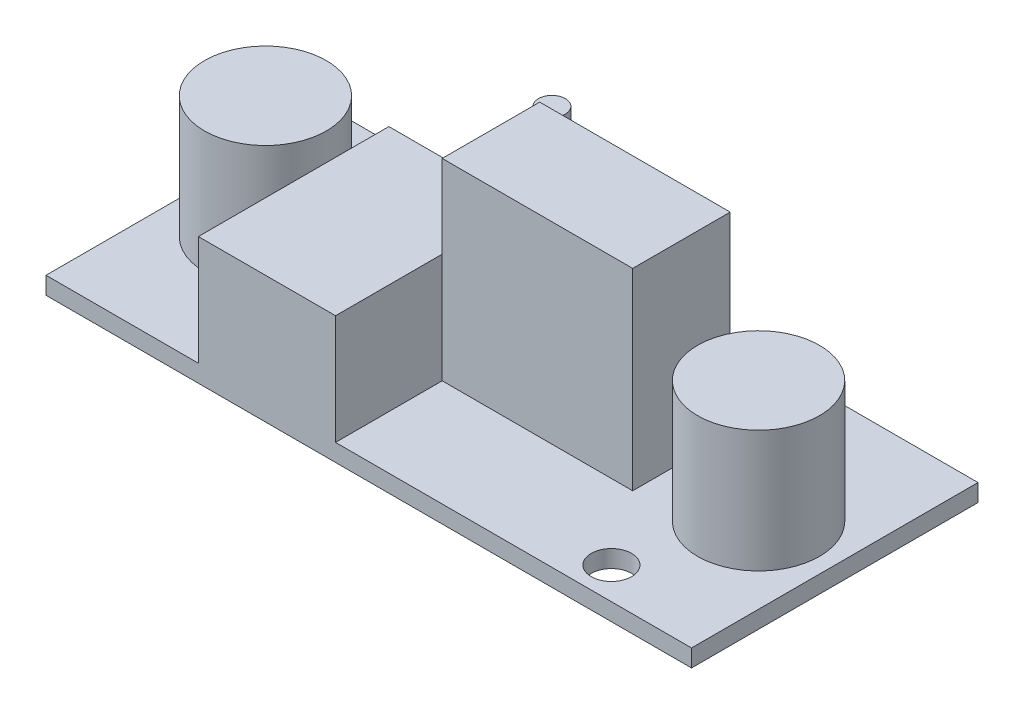
ISO-10303-21;
HEADER;
FILE_DESCRIPTION(('STEP AP214'),'2;1');
FILE_NAME('part.step','',(''),(''),'','','');
FILE_SCHEMA(('AUTOMOTIVE_DESIGN { 1 0 10303 214 1 1 1 1 }'));
ENDSEC;
DATA;
#1=APPLICATION_CONTEXT('core data for automotive mechanical design processes');
#2=APPLICATION_PROTOCOL_DEFINITION('international standard','automotive_design',2000,#1);
#3=PRODUCT_CONTEXT('',#1,'mechanical');
#4=PRODUCT('Part','Part','',(#3));
#5=PRODUCT_RELATED_PRODUCT_CATEGORY('part','',(#4));
#6=PRODUCT_DEFINITION_FORMATION('','',#4);
#7=PRODUCT_DEFINITION_CONTEXT('part definition',#1,'design');
#8=PRODUCT_DEFINITION('design','',#6,#7);
#9=PRODUCT_DEFINITION_SHAPE('','',#8);
#10=(LENGTH_UNIT() NAMED_UNIT(*) SI_UNIT(.MILLI.,.METRE.));
#11=(NAMED_UNIT(*) PLANE_ANGLE_UNIT() SI_UNIT($,.RADIAN.));
#12=(NAMED_UNIT(*) SI_UNIT($,.STERADIAN.) SOLID_ANGLE_UNIT());
#13=UNCERTAINTY_MEASURE_WITH_UNIT(LENGTH_MEASURE(1.E-05),#10,'distance_accuracy_value','');
#14=(GEOMETRIC_REPRESENTATION_CONTEXT(3) GLOBAL_UNCERTAINTY_ASSIGNED_CONTEXT((#13)) GLOBAL_UNIT_ASSIGNED_CONTEXT((#10,
#11,#12)) REPRESENTATION_CONTEXT('',''));
#15=CARTESIAN_POINT('',(0.,0.,0.));
#16=DIRECTION('',(0.,0.,1.));
#17=DIRECTION('',(1.,0.,0.));
#18=AXIS2_PLACEMENT_3D('',#15,#16,#17);
#19=CARTESIAN_POINT('',(-2.76860000000001,10.5918,11.938));
#20=DIRECTION('',(-1.,0.,0.));
#21=DIRECTION('',(0.,0.,1.));
#22=AXIS2_PLACEMENT_3D('',#19,#20,#21);
#23=PLANE('',#22);
#24=DIRECTION('',(0.,-1.,0.));
#25=VECTOR('',#24,1.);
#26=CARTESIAN_POINT('',(-2.76860000000001,17.5006,3.048));
#27=LINE('',#26,#25);
#28=CARTESIAN_POINT('',(-2.76860000000001,10.5918,3.048));
#29=VERTEX_POINT('',#28);
#30=CARTESIAN_POINT('',(-2.76860000000001,1.4478,3.048));
#31=VERTEX_POINT('',#30);
#32=EDGE_CURVE('E204',#29,#31,#27,.T.);
#33=ORIENTED_EDGE('',*,*,#32,.F.);
#34=DIRECTION('',(0.,0.,-1.));
#35=VECTOR('',#34,1.);
#36=CARTESIAN_POINT('',(-2.76860000000001,10.5918,11.938));
#37=LINE('',#36,#35);
#38=CARTESIAN_POINT('',(-2.76860000000001,10.5918,11.938));
#39=VERTEX_POINT('',#38);
#40=EDGE_CURVE('E240',#39,#29,#37,.T.);
#41=ORIENTED_EDGE('',*,*,#40,.F.);
#42=DIRECTION('',(0.,-1.,0.));
#43=VECTOR('',#42,1.);
#44=CARTESIAN_POINT('',(-2.76860000000001,10.5918,11.938));
#45=LINE('',#44,#43);
#46=CARTESIAN_POINT('',(-2.76860000000001,1.4478,11.938));
#47=VERTEX_POINT('',#46);
#48=EDGE_CURVE('E66',#39,#47,#45,.T.);
#49=ORIENTED_EDGE('',*,*,#48,.T.);
#50=DIRECTION('',(0.,0.,-1.));
#51=VECTOR('',#50,1.);
#52=CARTESIAN_POINT('',(-2.76860000000001,1.4478,11.938));
#53=LINE('',#52,#51);
#54=EDGE_CURVE('E251',#47,#31,#53,.T.);
#55=ORIENTED_EDGE('',*,*,#54,.T.);
#56=EDGE_LOOP('',(#33,#41,#49,#55));
#57=FACE_BOUND('',#56,.T.);
#58=ADVANCED_FACE('F43',(#57),#23,.F.);
#59=CARTESIAN_POINT('',(-26.8986,1.4478,-11.938));
#60=DIRECTION('',(0.,0.,-1.));
#61=DIRECTION('',(-1.,0.,0.));
#62=AXIS2_PLACEMENT_3D('',#59,#60,#61);
#63=PLANE('',#62);
#64=DIRECTION('',(1.,0.,0.));
#65=VECTOR('',#64,1.);
#66=CARTESIAN_POINT('',(-26.8986,0.,-11.938));
#67=LINE('',#66,#65);
#68=CARTESIAN_POINT('',(-26.8986,0.,-11.938));
#69=VERTEX_POINT('',#68);
#70=CARTESIAN_POINT('',(26.8986,0.,-11.938));
#71=VERTEX_POINT('',#70);
#72=EDGE_CURVE('E275',#69,#71,#67,.T.);
#73=ORIENTED_EDGE('',*,*,#72,.F.);
#74=DIRECTION('',(0.,-1.,0.));
#75=VECTOR('',#74,1.);
#76=CARTESIAN_POINT('',(-26.8986,1.4478,-11.938));
#77=LINE('',#76,#75);
#78=CARTESIAN_POINT('',(-26.8986,1.4478,-11.938));
#79=VERTEX_POINT('',#78);
#80=EDGE_CURVE('E309',#79,#69,#77,.T.);
#81=ORIENTED_EDGE('',*,*,#80,.F.);
#82=DIRECTION('',(1.,0.,0.));
#83=VECTOR('',#82,1.);
#84=CARTESIAN_POINT('',(-26.8986,1.4478,-11.938));
#85=LINE('',#84,#83);
#86=CARTESIAN_POINT('',(-8.61060000000001,1.4478,-11.938));
#87=VERTEX_POINT('',#86);
#88=EDGE_CURVE('E284',#79,#87,#85,.T.);
#89=ORIENTED_EDGE('',*,*,#88,.T.);
#90=DIRECTION('',(0.,-1.,0.));
#91=VECTOR('',#90,1.);
#92=CARTESIAN_POINT('',(-8.61060000000001,10.5918,-11.938));
#93=LINE('',#92,#91);
#94=CARTESIAN_POINT('',(-8.61060000000001,10.5918,-11.938));
#95=VERTEX_POINT('',#94);
#96=EDGE_CURVE('E58',#95,#87,#93,.T.);
#97=ORIENTED_EDGE('',*,*,#96,.F.);
#98=DIRECTION('',(1.,0.,0.));
#99=VECTOR('',#98,1.);
#100=CARTESIAN_POINT('',(-8.61060000000001,10.5918,-11.938));
#101=LINE('',#100,#99);
#102=CARTESIAN_POINT('',(0.86359999999999,10.5918,-11.938));
#103=VERTEX_POINT('',#102);
#104=EDGE_CURVE('E215',#95,#103,#101,.T.);
#105=ORIENTED_EDGE('',*,*,#104,.T.);
#106=DIRECTION('',(0.,-1.,0.));
#107=VECTOR('',#106,1.);
#108=CARTESIAN_POINT('',(0.86359999999999,10.5918,-11.938));
#109=LINE('',#108,#107);
#110=CARTESIAN_POINT('',(0.86359999999999,1.4478,-11.938));
#111=VERTEX_POINT('',#110);
#112=EDGE_CURVE('E230',#103,#111,#109,.T.);
#113=ORIENTED_EDGE('',*,*,#112,.T.);
#114=CARTESIAN_POINT('',(26.8986,1.4478,-11.938));
#115=VERTEX_POINT('',#114);
#116=EDGE_CURVE('E288',#111,#115,#85,.T.);
#117=ORIENTED_EDGE('',*,*,#116,.T.);
#118=DIRECTION('',(0.,-1.,0.));
#119=VECTOR('',#118,1.);
#120=CARTESIAN_POINT('',(26.8986,1.4478,-11.938));
#121=LINE('',#120,#119);
#122=EDGE_CURVE('E298',#115,#71,#121,.T.);
#123=ORIENTED_EDGE('',*,*,#122,.T.);
#124=EDGE_LOOP('',(#73,#81,#89,#97,#105,#113,#117,#123));
#125=FACE_BOUND('',#124,.T.);
#126=ADVANCED_FACE('F45',(#125),#63,.T.);
#127=CARTESIAN_POINT('',(-26.8986,1.4478,11.938));
#128=DIRECTION('',(-1.,0.,0.));
#129=DIRECTION('',(0.,0.,1.));
#130=AXIS2_PLACEMENT_3D('',#127,#128,#129);
#131=PLANE('',#130);
#132=DIRECTION('',(0.,0.,-1.));
#133=VECTOR('',#132,1.);
#134=CARTESIAN_POINT('',(-26.8986,0.,11.938));
#135=LINE('',#134,#133);
#136=CARTESIAN_POINT('',(-26.8986,0.,11.938));
#137=VERTEX_POINT('',#136);
#138=EDGE_CURVE('E306',#137,#69,#135,.T.);
#139=ORIENTED_EDGE('',*,*,#138,.F.);
#140=DIRECTION('',(0.,-1.,0.));
#141=VECTOR('',#140,1.);
#142=CARTESIAN_POINT('',(-26.8986,1.4478,11.938));
#143=LINE('',#142,#141);
#144=CARTESIAN_POINT('',(-26.8986,1.4478,11.938));
#145=VERTEX_POINT('',#144);
#146=EDGE_CURVE('E311',#145,#137,#143,.T.);
#147=ORIENTED_EDGE('',*,*,#146,.F.);
#148=DIRECTION('',(0.,0.,-1.));
#149=VECTOR('',#148,1.);
#150=CARTESIAN_POINT('',(-26.8986,1.4478,11.938));
#151=LINE('',#150,#149);
#152=EDGE_CURVE('E295',#145,#79,#151,.T.);
#153=ORIENTED_EDGE('',*,*,#152,.T.);
#154=ORIENTED_EDGE('',*,*,#80,.T.);
#155=EDGE_LOOP('',(#139,#147,#153,#154));
#156=FACE_BOUND('',#155,.T.);
#157=ADVANCED_FACE('F351',(#156),#131,.T.);
#158=CARTESIAN_POINT('',(-26.8986,1.4478,11.938));
#159=DIRECTION('',(0.,0.,-1.));
#160=DIRECTION('',(-1.,0.,0.));
#161=AXIS2_PLACEMENT_3D('',#158,#159,#160);
#162=PLANE('',#161);
#163=DIRECTION('',(1.,0.,0.));
#164=VECTOR('',#163,1.);
#165=CARTESIAN_POINT('',(-26.8986,0.,11.938));
#166=LINE('',#165,#164);
#167=CARTESIAN_POINT('',(26.8986,0.,11.938));
#168=VERTEX_POINT('',#167);
#169=EDGE_CURVE('E304',#137,#168,#166,.T.);
#170=ORIENTED_EDGE('',*,*,#169,.T.);
#171=DIRECTION('',(0.,-1.,0.));
#172=VECTOR('',#171,1.);
#173=CARTESIAN_POINT('',(26.8986,1.4478,11.938));
#174=LINE('',#173,#172);
#175=CARTESIAN_POINT('',(26.8986,1.4478,11.938));
#176=VERTEX_POINT('',#175);
#177=EDGE_CURVE('E313',#176,#168,#174,.T.);
#178=ORIENTED_EDGE('',*,*,#177,.F.);
#179=DIRECTION('',(1.,0.,0.));
#180=VECTOR('',#179,1.);
#181=CARTESIAN_POINT('',(-26.8986,1.4478,11.938));
#182=LINE('',#181,#180);
#183=EDGE_CURVE('E291',#47,#176,#182,.T.);
#184=ORIENTED_EDGE('',*,*,#183,.F.);
#185=ORIENTED_EDGE('',*,*,#48,.F.);
#186=DIRECTION('',(1.,0.,0.));
#187=VECTOR('',#186,1.);
#188=CARTESIAN_POINT('',(-14.1986,10.5918,11.938));
#189=LINE('',#188,#187);
#190=CARTESIAN_POINT('',(-14.1986,10.5918,11.938));
#191=VERTEX_POINT('',#190);
#192=EDGE_CURVE('E243',#191,#39,#189,.T.);
#193=ORIENTED_EDGE('',*,*,#192,.F.);
#194=DIRECTION('',(0.,-1.,0.));
#195=VECTOR('',#194,1.);
#196=CARTESIAN_POINT('',(-14.1986,10.5918,11.938));
#197=LINE('',#196,#195);
#198=CARTESIAN_POINT('',(-14.1986,1.4478,11.938));
#199=VERTEX_POINT('',#198);
#200=EDGE_CURVE('E258',#191,#199,#197,.T.);
#201=ORIENTED_EDGE('',*,*,#200,.T.);
#202=EDGE_CURVE('E292',#145,#199,#182,.T.);
#203=ORIENTED_EDGE('',*,*,#202,.F.);
#204=ORIENTED_EDGE('',*,*,#146,.T.);
#205=EDGE_LOOP('',(#170,#178,#184,#185,#193,#201,#203,#204));
#206=FACE_BOUND('',#205,.T.);
#207=ADVANCED_FACE('F537',(#206),#162,.F.);
#208=CARTESIAN_POINT('',(26.8986,1.4478,11.938));
#209=DIRECTION('',(-1.,0.,0.));
#210=DIRECTION('',(0.,0.,1.));
#211=AXIS2_PLACEMENT_3D('',#208,#209,#210);
#212=PLANE('',#211);
#213=DIRECTION('',(0.,0.,-1.));
#214=VECTOR('',#213,1.);
#215=CARTESIAN_POINT('',(26.8986,0.,11.938));
#216=LINE('',#215,#214);
#217=EDGE_CURVE('E301',#168,#71,#216,.T.);
#218=ORIENTED_EDGE('',*,*,#217,.T.);
#219=ORIENTED_EDGE('',*,*,#122,.F.);
#220=DIRECTION('',(0.,0.,-1.));
#221=VECTOR('',#220,1.);
#222=CARTESIAN_POINT('',(26.8986,1.4478,11.938));
#223=LINE('',#222,#221);
#224=EDGE_CURVE('E287',#176,#115,#223,.T.);
#225=ORIENTED_EDGE('',*,*,#224,.F.);
#226=ORIENTED_EDGE('',*,*,#177,.T.);
#227=EDGE_LOOP('',(#218,#219,#225,#226));
#228=FACE_BOUND('',#227,.T.);
#229=ADVANCED_FACE('F325',(#228),#212,.F.);
#230=CARTESIAN_POINT('',(0.,1.4478,0.));
#231=DIRECTION('',(0.,1.,0.));
#232=DIRECTION('',(0.,0.,1.));
#233=AXIS2_PLACEMENT_3D('',#230,#231,#232);
#234=PLANE('',#233);
#235=DIRECTION('',(0.,0.,-1.));
#236=VECTOR('',#235,1.);
#237=CARTESIAN_POINT('',(-2.76860000000001,1.4478,3.048));
#238=LINE('',#237,#236);
#239=CARTESIAN_POINT('',(-2.76860000000001,1.4478,-3.937));
#240=VERTEX_POINT('',#239);
#241=CARTESIAN_POINT('',(-2.76860000000001,1.4478,-5.08));
#242=VERTEX_POINT('',#241);
#243=EDGE_CURVE('E187',#240,#242,#238,.T.);
#244=ORIENTED_EDGE('',*,*,#243,.T.);
#245=DIRECTION('',(1.,0.,0.));
#246=VECTOR('',#245,1.);
#247=CARTESIAN_POINT('',(-2.76860000000001,1.4478,-5.08));
#248=LINE('',#247,#246);
#249=CARTESIAN_POINT('',(13.1064,1.4478,-5.08));
#250=VERTEX_POINT('',#249);
#251=EDGE_CURVE('E195',#242,#250,#248,.T.);
#252=ORIENTED_EDGE('',*,*,#251,.T.);
#253=DIRECTION('',(0.,0.,-1.));
#254=VECTOR('',#253,1.);
#255=CARTESIAN_POINT('',(13.1064,1.4478,3.048));
#256=LINE('',#255,#254);
#257=CARTESIAN_POINT('',(13.1064,1.4478,3.048));
#258=VERTEX_POINT('',#257);
#259=EDGE_CURVE('E178',#258,#250,#256,.T.);
#260=ORIENTED_EDGE('',*,*,#259,.F.);
#261=DIRECTION('',(1.,0.,0.));
#262=VECTOR('',#261,1.);
#263=CARTESIAN_POINT('',(-2.76860000000001,1.4478,3.048));
#264=LINE('',#263,#262);
#265=EDGE_CURVE('E190',#31,#258,#264,.T.);
#266=ORIENTED_EDGE('',*,*,#265,.F.);
#267=ORIENTED_EDGE('',*,*,#54,.F.);
#268=ORIENTED_EDGE('',*,*,#183,.T.);
#269=ORIENTED_EDGE('',*,*,#224,.T.);
#270=ORIENTED_EDGE('',*,*,#116,.F.);
#271=DIRECTION('',(0.,0.,1.));
#272=VECTOR('',#271,1.);
#273=CARTESIAN_POINT('',(0.86359999999999,1.4478,-11.938));
#274=LINE('',#273,#272);
#275=CARTESIAN_POINT('',(0.863599999999991,1.4478,-7.7216));
#276=VERTEX_POINT('',#275);
#277=EDGE_CURVE('E223',#111,#276,#274,.T.);
#278=ORIENTED_EDGE('',*,*,#277,.T.);
#279=DIRECTION('',(1.,0.,0.));
#280=VECTOR('',#279,1.);
#281=CARTESIAN_POINT('',(-8.61060000000001,1.4478,-7.7216));
#282=LINE('',#281,#280);
#283=CARTESIAN_POINT('',(-8.61060000000001,1.4478,-7.7216));
#284=VERTEX_POINT('',#283);
#285=EDGE_CURVE('E208',#284,#276,#282,.T.);
#286=ORIENTED_EDGE('',*,*,#285,.F.);
#287=DIRECTION('',(0.,0.,1.));
#288=VECTOR('',#287,1.);
#289=CARTESIAN_POINT('',(-8.61060000000001,1.4478,-11.938));
#290=LINE('',#289,#288);
#291=EDGE_CURVE('E212',#87,#284,#290,.T.);
#292=ORIENTED_EDGE('',*,*,#291,.F.);
#293=ORIENTED_EDGE('',*,*,#88,.F.);
#294=ORIENTED_EDGE('',*,*,#152,.F.);
#295=ORIENTED_EDGE('',*,*,#202,.T.);
#296=DIRECTION('',(0.,0.,-1.));
#297=VECTOR('',#296,1.);
#298=CARTESIAN_POINT('',(-14.1986,1.4478,11.938));
#299=LINE('',#298,#297);
#300=CARTESIAN_POINT('',(-14.1986,1.4478,-3.937));
#301=VERTEX_POINT('',#300);
#302=EDGE_CURVE('E239',#199,#301,#299,.T.);
#303=ORIENTED_EDGE('',*,*,#302,.T.);
#304=DIRECTION('',(1.,0.,0.));
#305=VECTOR('',#304,1.);
#306=CARTESIAN_POINT('',(-14.1986,1.4478,-3.937));
#307=LINE('',#306,#305);
#308=EDGE_CURVE('E234',#301,#240,#307,.T.);
#309=ORIENTED_EDGE('',*,*,#308,.T.);
#310=EDGE_LOOP('',(#244,#252,#260,#266,#267,#268,#269,#270,#278,#286,#292,#293,#294,#295,#303,#309));
#311=FACE_BOUND('',#310,.T.);
#312=CARTESIAN_POINT('',(-20.5486,1.4478,0.));
#313=DIRECTION('',(0.,1.,0.));
#314=DIRECTION('',(0.,0.,1.));
#315=AXIS2_PLACEMENT_3D('',#312,#313,#314);
#316=CIRCLE('',#315,5.08);
#317=CARTESIAN_POINT('',(-20.5486,1.4478,5.08));
#318=VERTEX_POINT('',#317);
#319=EDGE_CURVE('E263',#318,#318,#316,.T.);
#320=ORIENTED_EDGE('',*,*,#319,.F.);
#321=EDGE_LOOP('',(#320));
#322=FACE_BOUND('',#321,.T.);
#323=CARTESIAN_POINT('',(20.5486,1.4478,0.));
#324=DIRECTION('',(0.,1.,0.));
#325=DIRECTION('',(0.,0.,1.));
#326=AXIS2_PLACEMENT_3D('',#323,#324,#325);
#327=CIRCLE('',#326,5.08);
#328=CARTESIAN_POINT('',(20.5486,1.4478,5.07999999999996));
#329=VERTEX_POINT('',#328);
#330=EDGE_CURVE('E51',#329,#329,#327,.T.);
#331=ORIENTED_EDGE('',*,*,#330,.F.);
#332=EDGE_LOOP('',(#331));
#333=FACE_BOUND('',#332,.T.);
#334=CARTESIAN_POINT('',(-17.5768,1.4478,-9.29005));
#335=DIRECTION('',(0.,1.,0.));
#336=DIRECTION('',(0.,0.,1.));
#337=AXIS2_PLACEMENT_3D('',#334,#335,#336);
#338=CIRCLE('',#337,1.68275);
#339=CARTESIAN_POINT('',(-17.5768,1.4478,-7.6073));
#340=VERTEX_POINT('',#339);
#341=EDGE_CURVE('E276',#340,#340,#338,.T.);
#342=ORIENTED_EDGE('',*,*,#341,.F.);
#343=EDGE_LOOP('',(#342));
#344=FACE_BOUND('',#343,.T.);
#345=CARTESIAN_POINT('',(17.5768,1.4478,9.29005));
#346=DIRECTION('',(0.,1.,0.));
#347=DIRECTION('',(0.,0.,1.));
#348=AXIS2_PLACEMENT_3D('',#345,#346,#347);
#349=CIRCLE('',#348,1.68275);
#350=CARTESIAN_POINT('',(17.5768,1.4478,10.9728));
#351=VERTEX_POINT('',#350);
#352=EDGE_CURVE('E279',#351,#351,#349,.T.);
#353=ORIENTED_EDGE('',*,*,#352,.F.);
#354=EDGE_LOOP('',(#353));
#355=FACE_BOUND('',#354,.T.);
#356=ADVANCED_FACE('F321',(#311,#322,#333,#344,#355),#234,.T.);
#357=CARTESIAN_POINT('',(0.,0.,0.));
#358=DIRECTION('',(0.,1.,0.));
#359=DIRECTION('',(0.,0.,1.));
#360=AXIS2_PLACEMENT_3D('',#357,#358,#359);
#361=PLANE('',#360);
#362=CARTESIAN_POINT('',(-17.5768,0.,-9.29005));
#363=DIRECTION('',(0.,1.,0.));
#364=DIRECTION('',(0.,0.,1.));
#365=AXIS2_PLACEMENT_3D('',#362,#363,#364);
#366=CIRCLE('',#365,1.68275);
#367=CARTESIAN_POINT('',(-17.5768,0.,-7.6073));
#368=VERTEX_POINT('',#367);
#369=EDGE_CURVE('E272',#368,#368,#366,.T.);
#370=ORIENTED_EDGE('',*,*,#369,.T.);
#371=EDGE_LOOP('',(#370));
#372=FACE_BOUND('',#371,.T.);
#373=CARTESIAN_POINT('',(17.5768,0.,9.29005));
#374=DIRECTION('',(0.,1.,0.));
#375=DIRECTION('',(0.,0.,1.));
#376=AXIS2_PLACEMENT_3D('',#373,#374,#375);
#377=CIRCLE('',#376,1.68275);
#378=CARTESIAN_POINT('',(17.5768,0.,10.9728));
#379=VERTEX_POINT('',#378);
#380=EDGE_CURVE('E271',#379,#379,#377,.T.);
#381=ORIENTED_EDGE('',*,*,#380,.T.);
#382=EDGE_LOOP('',(#381));
#383=FACE_BOUND('',#382,.T.);
#384=ORIENTED_EDGE('',*,*,#72,.T.);
#385=ORIENTED_EDGE('',*,*,#217,.F.);
#386=ORIENTED_EDGE('',*,*,#169,.F.);
#387=ORIENTED_EDGE('',*,*,#138,.T.);
#388=EDGE_LOOP('',(#384,#385,#386,#387));
#389=FACE_BOUND('',#388,.T.);
#390=ADVANCED_FACE('F324',(#372,#383,#389),#361,.F.);
#391=CARTESIAN_POINT('',(17.5768,0.,9.29005));
#392=DIRECTION('',(0.,1.,0.));
#393=DIRECTION('',(0.,0.,1.));
#394=AXIS2_PLACEMENT_3D('',#391,#392,#393);
#395=CYLINDRICAL_SURFACE('',#394,1.68275);
#396=ORIENTED_EDGE('',*,*,#380,.F.);
#397=EDGE_LOOP('',(#396));
#398=FACE_BOUND('',#397,.T.);
#399=ORIENTED_EDGE('',*,*,#352,.T.);
#400=EDGE_LOOP('',(#399));
#401=FACE_BOUND('',#400,.T.);
#402=ADVANCED_FACE('F332',(#398,#401),#395,.F.);
#403=CARTESIAN_POINT('',(-17.5768,0.,-9.29005));
#404=DIRECTION('',(0.,1.,0.));
#405=DIRECTION('',(0.,0.,1.));
#406=AXIS2_PLACEMENT_3D('',#403,#404,#405);
#407=CYLINDRICAL_SURFACE('',#406,1.68275);
#408=ORIENTED_EDGE('',*,*,#369,.F.);
#409=EDGE_LOOP('',(#408));
#410=FACE_BOUND('',#409,.T.);
#411=ORIENTED_EDGE('',*,*,#341,.T.);
#412=EDGE_LOOP('',(#411));
#413=FACE_BOUND('',#412,.T.);
#414=ADVANCED_FACE('F334',(#410,#413),#407,.F.);
#415=CARTESIAN_POINT('',(20.5486,11.6078,0.));
#416=DIRECTION('',(0.,-1.,0.));
#417=DIRECTION('',(0.,0.,-1.));
#418=AXIS2_PLACEMENT_3D('',#415,#416,#417);
#419=CYLINDRICAL_SURFACE('',#418,5.08);
#420=CARTESIAN_POINT('',(20.5486,11.6078,0.));
#421=DIRECTION('',(0.,1.,0.));
#422=DIRECTION('',(0.,0.,1.));
#423=AXIS2_PLACEMENT_3D('',#420,#421,#422);
#424=CIRCLE('',#423,5.08);
#425=CARTESIAN_POINT('',(20.5486,11.6078,5.07999999999996));
#426=VERTEX_POINT('',#425);
#427=EDGE_CURVE('E266',#426,#426,#424,.F.);
#428=ORIENTED_EDGE('',*,*,#427,.T.);
#429=EDGE_LOOP('',(#428));
#430=FACE_BOUND('',#429,.T.);
#431=ORIENTED_EDGE('',*,*,#330,.T.);
#432=EDGE_LOOP('',(#431));
#433=FACE_BOUND('',#432,.T.);
#434=ADVANCED_FACE('F319',(#430,#433),#419,.T.);
#435=CARTESIAN_POINT('',(0.,11.6078,0.));
#436=DIRECTION('',(0.,1.,0.));
#437=DIRECTION('',(0.,0.,1.));
#438=AXIS2_PLACEMENT_3D('',#435,#436,#437);
#439=PLANE('',#438);
#440=ORIENTED_EDGE('',*,*,#427,.F.);
#441=EDGE_LOOP('',(#440));
#442=FACE_BOUND('',#441,.T.);
#443=ADVANCED_FACE('F366',(#442),#439,.T.);
#444=CARTESIAN_POINT('',(-20.5486,11.6078,0.));
#445=DIRECTION('',(0.,-1.,0.));
#446=DIRECTION('',(0.,0.,-1.));
#447=AXIS2_PLACEMENT_3D('',#444,#445,#446);
#448=CYLINDRICAL_SURFACE('',#447,5.08);
#449=CARTESIAN_POINT('',(-20.5486,11.6078,0.));
#450=DIRECTION('',(0.,1.,0.));
#451=DIRECTION('',(0.,0.,1.));
#452=AXIS2_PLACEMENT_3D('',#449,#450,#451);
#453=CIRCLE('',#452,5.08);
#454=CARTESIAN_POINT('',(-20.5486,11.6078,5.08));
#455=VERTEX_POINT('',#454);
#456=EDGE_CURVE('E257',#455,#455,#453,.T.);
#457=ORIENTED_EDGE('',*,*,#456,.F.);
#458=EDGE_LOOP('',(#457));
#459=FACE_BOUND('',#458,.T.);
#460=ORIENTED_EDGE('',*,*,#319,.T.);
#461=EDGE_LOOP('',(#460));
#462=FACE_BOUND('',#461,.T.);
#463=ADVANCED_FACE('F363',(#459,#462),#448,.T.);
#464=CARTESIAN_POINT('',(0.,11.6078,0.));
#465=DIRECTION('',(0.,1.,0.));
#466=DIRECTION('',(0.,0.,1.));
#467=AXIS2_PLACEMENT_3D('',#464,#465,#466);
#468=PLANE('',#467);
#469=ORIENTED_EDGE('',*,*,#456,.T.);
#470=EDGE_LOOP('',(#469));
#471=FACE_BOUND('',#470,.T.);
#472=ADVANCED_FACE('F361',(#471),#468,.T.);
#473=CARTESIAN_POINT('',(-14.1986,10.5918,-3.937));
#474=DIRECTION('',(0.,0.,-1.));
#475=DIRECTION('',(-1.,0.,0.));
#476=AXIS2_PLACEMENT_3D('',#473,#474,#475);
#477=PLANE('',#476);
#478=ORIENTED_EDGE('',*,*,#308,.F.);
#479=DIRECTION('',(0.,-1.,0.));
#480=VECTOR('',#479,1.);
#481=CARTESIAN_POINT('',(-14.1986,10.5918,-3.937));
#482=LINE('',#481,#480);
#483=CARTESIAN_POINT('',(-14.1986,10.5918,-3.937));
#484=VERTEX_POINT('',#483);
#485=EDGE_CURVE('E255',#484,#301,#482,.T.);
#486=ORIENTED_EDGE('',*,*,#485,.F.);
#487=DIRECTION('',(1.,0.,0.));
#488=VECTOR('',#487,1.);
#489=CARTESIAN_POINT('',(-14.1986,10.5918,-3.937));
#490=LINE('',#489,#488);
#491=CARTESIAN_POINT('',(-2.76860000000001,10.5918,-3.937));
#492=VERTEX_POINT('',#491);
#493=EDGE_CURVE('E235',#484,#492,#490,.T.);
#494=ORIENTED_EDGE('',*,*,#493,.T.);
#495=DIRECTION('',(0.,-1.,0.));
#496=VECTOR('',#495,1.);
#497=CARTESIAN_POINT('',(-2.76860000000001,10.5918,-3.937));
#498=LINE('',#497,#496);
#499=EDGE_CURVE('E248',#492,#240,#498,.T.);
#500=ORIENTED_EDGE('',*,*,#499,.T.);
#501=EDGE_LOOP('',(#478,#486,#494,#500));
#502=FACE_BOUND('',#501,.T.);
#503=ADVANCED_FACE('F358',(#502),#477,.T.);
#504=CARTESIAN_POINT('',(-14.1986,10.5918,11.938));
#505=DIRECTION('',(-1.,0.,0.));
#506=DIRECTION('',(0.,0.,1.));
#507=AXIS2_PLACEMENT_3D('',#504,#505,#506);
#508=PLANE('',#507);
#509=ORIENTED_EDGE('',*,*,#302,.F.);
#510=ORIENTED_EDGE('',*,*,#200,.F.);
#511=DIRECTION('',(0.,0.,-1.));
#512=VECTOR('',#511,1.);
#513=CARTESIAN_POINT('',(-14.1986,10.5918,11.938));
#514=LINE('',#513,#512);
#515=EDGE_CURVE('E245',#191,#484,#514,.T.);
#516=ORIENTED_EDGE('',*,*,#515,.T.);
#517=ORIENTED_EDGE('',*,*,#485,.T.);
#518=EDGE_LOOP('',(#509,#510,#516,#517));
#519=FACE_BOUND('',#518,.T.);
#520=ADVANCED_FACE('F356',(#519),#508,.T.);
#521=CARTESIAN_POINT('',(0.,10.5918,0.));
#522=DIRECTION('',(0.,1.,0.));
#523=DIRECTION('',(0.,0.,1.));
#524=AXIS2_PLACEMENT_3D('',#521,#522,#523);
#525=PLANE('',#524);
#526=ORIENTED_EDGE('',*,*,#493,.F.);
#527=ORIENTED_EDGE('',*,*,#515,.F.);
#528=ORIENTED_EDGE('',*,*,#192,.T.);
#529=ORIENTED_EDGE('',*,*,#40,.T.);
#530=EDGE_CURVE('E238',#29,#492,#37,.T.);
#531=ORIENTED_EDGE('',*,*,#530,.T.);
#532=EDGE_LOOP('',(#526,#527,#528,#529,#531));
#533=FACE_BOUND('',#532,.T.);
#534=ADVANCED_FACE('F406',(#533),#525,.T.);
#535=CARTESIAN_POINT('',(-8.61060000000001,10.5918,-7.7216));
#536=DIRECTION('',(0.,0.,-1.));
#537=DIRECTION('',(-1.,0.,0.));
#538=AXIS2_PLACEMENT_3D('',#535,#536,#537);
#539=PLANE('',#538);
#540=ORIENTED_EDGE('',*,*,#285,.T.);
#541=DIRECTION('',(0.,-1.,0.));
#542=VECTOR('',#541,1.);
#543=CARTESIAN_POINT('',(0.863599999999991,10.5918,-7.7216));
#544=LINE('',#543,#542);
#545=CARTESIAN_POINT('',(0.863599999999991,10.5918,-7.7216));
#546=VERTEX_POINT('',#545);
#547=EDGE_CURVE('E232',#546,#276,#544,.T.);
#548=ORIENTED_EDGE('',*,*,#547,.F.);
#549=DIRECTION('',(1.,0.,0.));
#550=VECTOR('',#549,1.);
#551=CARTESIAN_POINT('',(-8.61060000000001,10.5918,-7.7216));
#552=LINE('',#551,#550);
#553=CARTESIAN_POINT('',(-8.61060000000001,10.5918,-7.7216));
#554=VERTEX_POINT('',#553);
#555=EDGE_CURVE('E209',#554,#546,#552,.T.);
#556=ORIENTED_EDGE('',*,*,#555,.F.);
#557=DIRECTION('',(0.,-1.,0.));
#558=VECTOR('',#557,1.);
#559=CARTESIAN_POINT('',(-8.61060000000001,10.5918,-7.7216));
#560=LINE('',#559,#558);
#561=EDGE_CURVE('E220',#554,#284,#560,.T.);
#562=ORIENTED_EDGE('',*,*,#561,.T.);
#563=EDGE_LOOP('',(#540,#548,#556,#562));
#564=FACE_BOUND('',#563,.T.);
#565=ADVANCED_FACE('F413',(#564),#539,.F.);
#566=CARTESIAN_POINT('',(0.86359999999999,10.5918,-11.938));
#567=DIRECTION('',(1.,0.,0.));
#568=DIRECTION('',(0.,0.,-1.));
#569=AXIS2_PLACEMENT_3D('',#566,#567,#568);
#570=PLANE('',#569);
#571=ORIENTED_EDGE('',*,*,#277,.F.);
#572=ORIENTED_EDGE('',*,*,#112,.F.);
#573=DIRECTION('',(0.,0.,1.));
#574=VECTOR('',#573,1.);
#575=CARTESIAN_POINT('',(0.86359999999999,10.5918,-11.938));
#576=LINE('',#575,#574);
#577=EDGE_CURVE('E211',#103,#546,#576,.T.);
#578=ORIENTED_EDGE('',*,*,#577,.T.);
#579=ORIENTED_EDGE('',*,*,#547,.T.);
#580=EDGE_LOOP('',(#571,#572,#578,#579));
#581=FACE_BOUND('',#580,.T.);
#582=ADVANCED_FACE('F421',(#581),#570,.T.);
#583=CARTESIAN_POINT('',(-8.61060000000001,10.5918,-11.938));
#584=DIRECTION('',(1.,0.,0.));
#585=DIRECTION('',(0.,0.,-1.));
#586=AXIS2_PLACEMENT_3D('',#583,#584,#585);
#587=PLANE('',#586);
#588=ORIENTED_EDGE('',*,*,#291,.T.);
#589=ORIENTED_EDGE('',*,*,#561,.F.);
#590=DIRECTION('',(0.,0.,1.));
#591=VECTOR('',#590,1.);
#592=CARTESIAN_POINT('',(-8.61060000000001,10.5918,-11.938));
#593=LINE('',#592,#591);
#594=EDGE_CURVE('E218',#95,#554,#593,.T.);
#595=ORIENTED_EDGE('',*,*,#594,.F.);
#596=ORIENTED_EDGE('',*,*,#96,.T.);
#597=EDGE_LOOP('',(#588,#589,#595,#596));
#598=FACE_BOUND('',#597,.T.);
#599=ADVANCED_FACE('F429',(#598),#587,.F.);
#600=CARTESIAN_POINT('',(0.,10.5918,0.));
#601=DIRECTION('',(0.,-1.,0.));
#602=DIRECTION('',(0.,0.,-1.));
#603=AXIS2_PLACEMENT_3D('',#600,#601,#602);
#604=PLANE('',#603);
#605=CARTESIAN_POINT('',(-7.34060000000001,10.5918,-10.668));
#606=DIRECTION('',(0.,-1.,0.));
#607=DIRECTION('',(0.,0.,-1.));
#608=AXIS2_PLACEMENT_3D('',#605,#606,#607);
#609=CIRCLE('',#608,1.1176);
#610=CARTESIAN_POINT('',(-7.34060000000001,10.5918,-11.7856));
#611=VERTEX_POINT('',#610);
#612=EDGE_CURVE('E12',#611,#611,#609,.F.);
#613=ORIENTED_EDGE('',*,*,#612,.F.);
#614=EDGE_LOOP('',(#613));
#615=FACE_BOUND('',#614,.T.);
#616=ORIENTED_EDGE('',*,*,#555,.T.);
#617=ORIENTED_EDGE('',*,*,#577,.F.);
#618=ORIENTED_EDGE('',*,*,#104,.F.);
#619=ORIENTED_EDGE('',*,*,#594,.T.);
#620=EDGE_LOOP('',(#616,#617,#618,#619));
#621=FACE_BOUND('',#620,.T.);
#622=ADVANCED_FACE('F437',(#615,#621),#604,.F.);
#623=CARTESIAN_POINT('',(-7.34060000000001,12.1158,-10.668));
#624=DIRECTION('',(0.,-1.,0.));
#625=DIRECTION('',(0.,0.,-1.));
#626=AXIS2_PLACEMENT_3D('',#623,#624,#625);
#627=CYLINDRICAL_SURFACE('',#626,1.1176);
#628=CARTESIAN_POINT('',(-7.34060000000001,12.1158,-10.668));
#629=DIRECTION('',(0.,1.,0.));
#630=DIRECTION('',(0.,0.,1.));
#631=AXIS2_PLACEMENT_3D('',#628,#629,#630);
#632=CIRCLE('',#631,1.1176);
#633=CARTESIAN_POINT('',(-7.34060000000001,12.1158,-11.7856));
#634=VERTEX_POINT('',#633);
#635=EDGE_CURVE('E200',#634,#634,#632,.T.);
#636=CARTESIAN_POINT('',(-7.34060000000001,12.1158,-11.7856));
#637=CARTESIAN_POINT('',(-7.34060000000001,12.099925,-11.7856));
#638=CARTESIAN_POINT('',(-7.34060000000001,12.08405,-11.7856));
#639=CARTESIAN_POINT('',(-7.34060000000001,12.0523,-11.7856));
#640=CARTESIAN_POINT('',(-7.34060000000001,12.036425,-11.7856));
#641=CARTESIAN_POINT('',(-7.34060000000001,12.004675,-11.7856));
#642=CARTESIAN_POINT('',(-7.34060000000001,11.9888,-11.7856));
#643=CARTESIAN_POINT('',(-7.34060000000001,11.95705,-11.7856));
#644=CARTESIAN_POINT('',(-7.34060000000001,11.941175,-11.7856));
#645=CARTESIAN_POINT('',(-7.34060000000001,11.909425,-11.7856));
#646=CARTESIAN_POINT('',(-7.34060000000001,11.89355,-11.7856));
#647=CARTESIAN_POINT('',(-7.34060000000001,11.8618,-11.7856));
#648=CARTESIAN_POINT('',(-7.34060000000001,11.845925,-11.7856));
#649=CARTESIAN_POINT('',(-7.34060000000001,11.814175,-11.7856));
#650=CARTESIAN_POINT('',(-7.34060000000001,11.7983,-11.7856));
#651=CARTESIAN_POINT('',(-7.34060000000001,11.76655,-11.7856));
#652=CARTESIAN_POINT('',(-7.34060000000001,11.750675,-11.7856));
#653=CARTESIAN_POINT('',(-7.34060000000001,11.718925,-11.7856));
#654=CARTESIAN_POINT('',(-7.34060000000001,11.70305,-11.7856));
#655=CARTESIAN_POINT('',(-7.34060000000001,11.6713,-11.7856));
#656=CARTESIAN_POINT('',(-7.34060000000001,11.655425,-11.7856));
#657=CARTESIAN_POINT('',(-7.34060000000001,11.623675,-11.7856));
#658=CARTESIAN_POINT('',(-7.34060000000001,11.6078,-11.7856));
#659=CARTESIAN_POINT('',(-7.34060000000001,11.57605,-11.7856));
#660=CARTESIAN_POINT('',(-7.34060000000001,11.560175,-11.7856));
#661=CARTESIAN_POINT('',(-7.34060000000001,11.528425,-11.7856));
#662=CARTESIAN_POINT('',(-7.34060000000001,11.51255,-11.7856));
#663=CARTESIAN_POINT('',(-7.34060000000001,11.4808,-11.7856));
#664=CARTESIAN_POINT('',(-7.34060000000001,11.464925,-11.7856));
#665=CARTESIAN_POINT('',(-7.34060000000001,11.433175,-11.7856));
#666=CARTESIAN_POINT('',(-7.34060000000001,11.4173,-11.7856));
#667=CARTESIAN_POINT('',(-7.34060000000001,11.38555,-11.7856));
#668=CARTESIAN_POINT('',(-7.34060000000001,11.369675,-11.7856));
#669=CARTESIAN_POINT('',(-7.34060000000001,11.337925,-11.7856));
#670=CARTESIAN_POINT('',(-7.34060000000001,11.32205,-11.7856));
#671=CARTESIAN_POINT('',(-7.34060000000001,11.2903,-11.7856));
#672=CARTESIAN_POINT('',(-7.34060000000001,11.274425,-11.7856));
#673=CARTESIAN_POINT('',(-7.34060000000001,11.242675,-11.7856));
#674=CARTESIAN_POINT('',(-7.34060000000001,11.2268,-11.7856));
#675=CARTESIAN_POINT('',(-7.34060000000001,11.19505,-11.7856));
#676=CARTESIAN_POINT('',(-7.34060000000001,11.179175,-11.7856));
#677=CARTESIAN_POINT('',(-7.34060000000001,11.147425,-11.7856));
#678=CARTESIAN_POINT('',(-7.34060000000001,11.13155,-11.7856));
#679=CARTESIAN_POINT('',(-7.34060000000001,11.0998,-11.7856));
#680=CARTESIAN_POINT('',(-7.34060000000001,11.083925,-11.7856));
#681=CARTESIAN_POINT('',(-7.34060000000001,11.052175,-11.7856));
#682=CARTESIAN_POINT('',(-7.34060000000001,11.0363,-11.7856));
#683=CARTESIAN_POINT('',(-7.34060000000001,11.00455,-11.7856));
#684=CARTESIAN_POINT('',(-7.34060000000001,10.988675,-11.7856));
#685=CARTESIAN_POINT('',(-7.34060000000001,10.956925,-11.7856));
#686=CARTESIAN_POINT('',(-7.34060000000001,10.94105,-11.7856));
#687=CARTESIAN_POINT('',(-7.34060000000001,10.9093,-11.7856));
#688=CARTESIAN_POINT('',(-7.34060000000001,10.893425,-11.7856));
#689=CARTESIAN_POINT('',(-7.34060000000001,10.861675,-11.7856));
#690=CARTESIAN_POINT('',(-7.34060000000001,10.8458,-11.7856));
#691=CARTESIAN_POINT('',(-7.34060000000001,10.81405,-11.7856));
#692=CARTESIAN_POINT('',(-7.34060000000001,10.798175,-11.7856));
#693=CARTESIAN_POINT('',(-7.34060000000001,10.766425,-11.7856));
#694=CARTESIAN_POINT('',(-7.34060000000001,10.75055,-11.7856));
#695=CARTESIAN_POINT('',(-7.34060000000001,10.7188,-11.7856));
#696=CARTESIAN_POINT('',(-7.34060000000001,10.702925,-11.7856));
#697=CARTESIAN_POINT('',(-7.34060000000001,10.671175,-11.7856));
#698=CARTESIAN_POINT('',(-7.34060000000001,10.6553,-11.7856));
#699=CARTESIAN_POINT('',(-7.34060000000001,10.62355,-11.7856));
#700=CARTESIAN_POINT('',(-7.34060000000001,10.607675,-11.7856));
#701=CARTESIAN_POINT('',(-7.34060000000001,10.5918,-11.7856));
#702=B_SPLINE_CURVE_WITH_KNOTS('',3,(#636,#637,#638,#639,#640,#641,#642,#643,#644,#645,#646,
#647,#648,#649,#650,#651,#652,#653,#654,#655,#656,#657,#658,#659,#660,#661,#662,#663,#664,#665,
#666,#667,#668,#669,#670,#671,#672,#673,#674,#675,#676,#677,#678,#679,#680,#681,#682,#683,#684,
#685,#686,#687,#688,#689,#690,#691,#692,#693,#694,#695,#696,#697,#698,#699,#700,#701),
.UNSPECIFIED.,.F.,.F.,(4,2,2,2,2,2,2,2,2,2,2,2,2,2,2,2,2,2,2,2,2,2,2,2,2,2,2,2,2,2,2,2,4),(0.,
0.0476250000000008,0.0952499999999998,0.142875000000001,0.1905,0.238125,0.28575,0.333375,
0.380999999999999,0.428625,0.476249999999999,0.523875,0.571499999999999,0.619125,
0.666749999999999,0.714375,0.761999999999999,0.809625,0.857249999999999,0.904874999999999,
0.952499999999998,1.000125,1.04775,1.095375,1.143,1.190625,1.23825,1.285875,1.3335,1.381125,
1.42875,1.476375,1.524),.UNSPECIFIED.);
#703=EDGE_CURVE('BSEAM444',#634,#611,#702,.T.);
#704=ORIENTED_EDGE('',*,*,#635,.F.);
#705=ORIENTED_EDGE('',*,*,#612,.T.);
#706=ORIENTED_EDGE('',*,*,#703,.T.);
#707=ORIENTED_EDGE('',*,*,#703,.F.);
#708=EDGE_LOOP('',(#704,#706,#705,#707));
#709=FACE_BOUND('',#708,.T.);
#710=ADVANCED_FACE('F444',(#709),#627,.T.);
#711=CARTESIAN_POINT('',(-7.34060000000001,12.1158,-10.668));
#712=DIRECTION('',(0.,1.,0.));
#713=DIRECTION('',(0.,0.,1.));
#714=AXIS2_PLACEMENT_3D('',#711,#712,#713);
#715=PLANE('',#714);
#716=ORIENTED_EDGE('',*,*,#635,.T.);
#717=EDGE_LOOP('',(#716));
#718=FACE_BOUND('',#717,.T.);
#719=ADVANCED_FACE('F452',(#718),#715,.T.);
#720=CARTESIAN_POINT('',(-2.76860000000001,17.5006,-5.08));
#721=DIRECTION('',(0.,0.,-1.));
#722=DIRECTION('',(-1.,0.,0.));
#723=AXIS2_PLACEMENT_3D('',#720,#721,#722);
#724=PLANE('',#723);
#725=ORIENTED_EDGE('',*,*,#251,.F.);
#726=DIRECTION('',(0.,-1.,0.));
#727=VECTOR('',#726,1.);
#728=CARTESIAN_POINT('',(-2.76860000000001,17.5006,-5.08));
#729=LINE('',#728,#727);
#730=CARTESIAN_POINT('',(-2.76860000000001,17.5006,-5.08));
#731=VERTEX_POINT('',#730);
#732=EDGE_CURVE('E186',#731,#242,#729,.T.);
#733=ORIENTED_EDGE('',*,*,#732,.F.);
#734=DIRECTION('',(1.,0.,0.));
#735=VECTOR('',#734,1.);
#736=CARTESIAN_POINT('',(-2.76860000000001,17.5006,-5.08));
#737=LINE('',#736,#735);
#738=CARTESIAN_POINT('',(13.1064,17.5006,-5.08));
#739=VERTEX_POINT('',#738);
#740=EDGE_CURVE('E166',#731,#739,#737,.T.);
#741=ORIENTED_EDGE('',*,*,#740,.T.);
#742=DIRECTION('',(0.,-1.,0.));
#743=VECTOR('',#742,1.);
#744=CARTESIAN_POINT('',(13.1064,17.5006,-5.08));
#745=LINE('',#744,#743);
#746=EDGE_CURVE('E175',#739,#250,#745,.T.);
#747=ORIENTED_EDGE('',*,*,#746,.T.);
#748=EDGE_LOOP('',(#725,#733,#741,#747));
#749=FACE_BOUND('',#748,.T.);
#750=ADVANCED_FACE('F185',(#749),#724,.T.);
#751=CARTESIAN_POINT('',(-2.76860000000001,17.5006,3.048));
#752=DIRECTION('',(-1.,0.,0.));
#753=DIRECTION('',(0.,0.,1.));
#754=AXIS2_PLACEMENT_3D('',#751,#752,#753);
#755=PLANE('',#754);
#756=ORIENTED_EDGE('',*,*,#243,.F.);
#757=ORIENTED_EDGE('',*,*,#499,.F.);
#758=ORIENTED_EDGE('',*,*,#530,.F.);
#759=CARTESIAN_POINT('',(-2.76860000000001,17.5006,3.048));
#760=VERTEX_POINT('',#759);
#761=EDGE_CURVE('E201',#760,#29,#27,.T.);
#762=ORIENTED_EDGE('',*,*,#761,.F.);
#763=DIRECTION('',(0.,0.,-1.));
#764=VECTOR('',#763,1.);
#765=CARTESIAN_POINT('',(-2.76860000000001,17.5006,3.048));
#766=LINE('',#765,#764);
#767=EDGE_CURVE('E183',#760,#731,#766,.T.);
#768=ORIENTED_EDGE('',*,*,#767,.T.);
#769=ORIENTED_EDGE('',*,*,#732,.T.);
#770=EDGE_LOOP('',(#756,#757,#758,#762,#768,#769));
#771=FACE_BOUND('',#770,.T.);
#772=ADVANCED_FACE('F466',(#771),#755,.T.);
#773=CARTESIAN_POINT('',(-2.76860000000001,17.5006,3.048));
#774=DIRECTION('',(0.,0.,-1.));
#775=DIRECTION('',(-1.,0.,0.));
#776=AXIS2_PLACEMENT_3D('',#773,#774,#775);
#777=PLANE('',#776);
#778=ORIENTED_EDGE('',*,*,#265,.T.);
#779=DIRECTION('',(0.,-1.,0.));
#780=VECTOR('',#779,1.);
#781=CARTESIAN_POINT('',(13.1064,17.5006,3.048));
#782=LINE('',#781,#780);
#783=CARTESIAN_POINT('',(13.1064,17.5006,3.048));
#784=VERTEX_POINT('',#783);
#785=EDGE_CURVE('E182',#784,#258,#782,.T.);
#786=ORIENTED_EDGE('',*,*,#785,.F.);
#787=DIRECTION('',(1.,0.,0.));
#788=VECTOR('',#787,1.);
#789=CARTESIAN_POINT('',(-2.76860000000001,17.5006,3.048));
#790=LINE('',#789,#788);
#791=EDGE_CURVE('E169',#760,#784,#790,.T.);
#792=ORIENTED_EDGE('',*,*,#791,.F.);
#793=ORIENTED_EDGE('',*,*,#761,.T.);
#794=ORIENTED_EDGE('',*,*,#32,.T.);
#795=EDGE_LOOP('',(#778,#786,#792,#793,#794));
#796=FACE_BOUND('',#795,.T.);
#797=ADVANCED_FACE('F473',(#796),#777,.F.);
#798=CARTESIAN_POINT('',(13.1064,17.5006,3.048));
#799=DIRECTION('',(-1.,0.,0.));
#800=DIRECTION('',(0.,0.,1.));
#801=AXIS2_PLACEMENT_3D('',#798,#799,#800);
#802=PLANE('',#801);
#803=ORIENTED_EDGE('',*,*,#259,.T.);
#804=ORIENTED_EDGE('',*,*,#746,.F.);
#805=DIRECTION('',(0.,0.,-1.));
#806=VECTOR('',#805,1.);
#807=CARTESIAN_POINT('',(13.1064,17.5006,3.048));
#808=LINE('',#807,#806);
#809=EDGE_CURVE('E161',#784,#739,#808,.T.);
#810=ORIENTED_EDGE('',*,*,#809,.F.);
#811=ORIENTED_EDGE('',*,*,#785,.T.);
#812=EDGE_LOOP('',(#803,#804,#810,#811));
#813=FACE_BOUND('',#812,.T.);
#814=ADVANCED_FACE('F176',(#813),#802,.F.);
#815=CARTESIAN_POINT('',(0.,17.5006,0.));
#816=DIRECTION('',(0.,1.,0.));
#817=DIRECTION('',(0.,0.,1.));
#818=AXIS2_PLACEMENT_3D('',#815,#816,#817);
#819=PLANE('',#818);
#820=ORIENTED_EDGE('',*,*,#740,.F.);
#821=ORIENTED_EDGE('',*,*,#767,.F.);
#822=ORIENTED_EDGE('',*,*,#791,.T.);
#823=ORIENTED_EDGE('',*,*,#809,.T.);
#824=EDGE_LOOP('',(#820,#821,#822,#823));
#825=FACE_BOUND('',#824,.T.);
#826=ADVANCED_FACE('F163',(#825),#819,.T.);
#827=CLOSED_SHELL('',(#58,#126,#157,#207,#229,#356,#390,#402,#414,#434,#443,#463,#472,#503,#520,
#534,#565,#582,#599,#622,#710,#719,#750,#772,#797,#814,#826));
#828=MANIFOLD_SOLID_BREP('B2',#827);
#829=ADVANCED_BREP_SHAPE_REPRESENTATION('',(#18,#828),#14);
#830=SHAPE_DEFINITION_REPRESENTATION(#9,#829);
ENDSEC;
END-ISO-10303-21;
